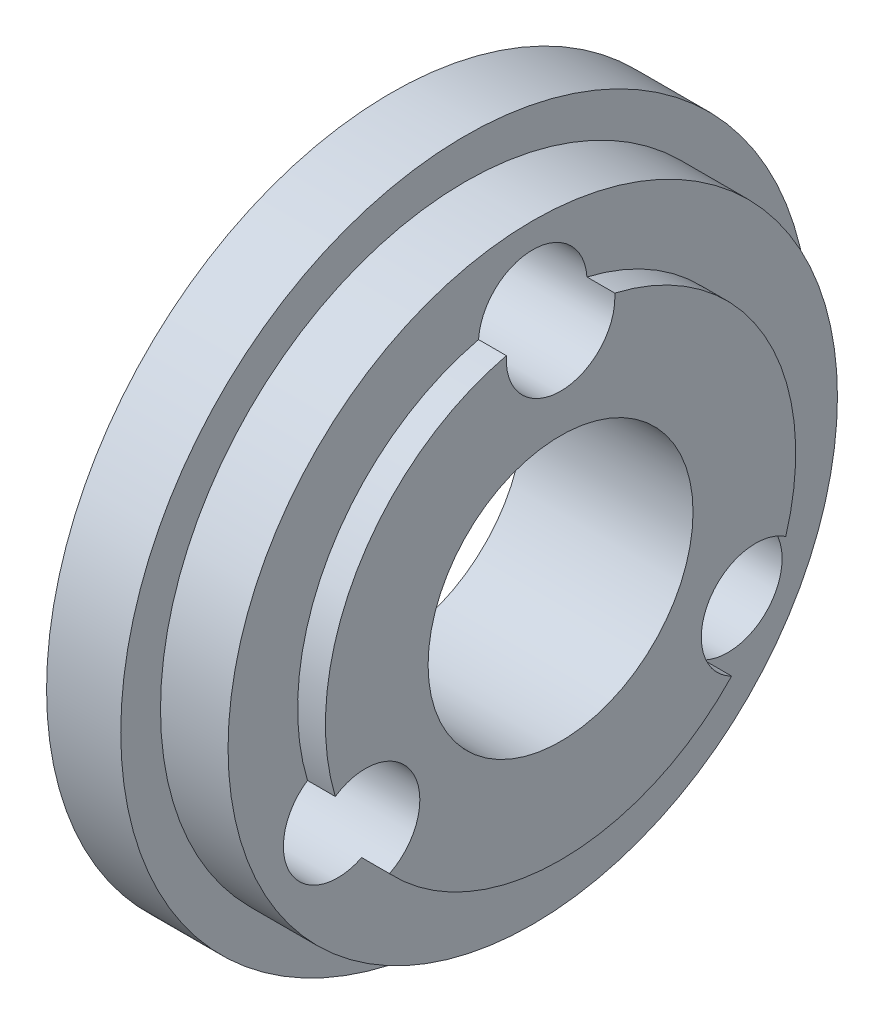
ISO-10303-21;
HEADER;
FILE_DESCRIPTION(('STEP AP214'),'2;1');
FILE_NAME('part.step','',(''),(''),'','','');
FILE_SCHEMA(('AUTOMOTIVE_DESIGN { 1 0 10303 214 1 1 1 1 }'));
ENDSEC;
DATA;
#1=APPLICATION_CONTEXT('core data for automotive mechanical design processes');
#2=APPLICATION_PROTOCOL_DEFINITION('international standard','automotive_design',2000,#1);
#3=PRODUCT_CONTEXT('',#1,'mechanical');
#4=PRODUCT('Part','Part','',(#3));
#5=PRODUCT_RELATED_PRODUCT_CATEGORY('part','',(#4));
#6=PRODUCT_DEFINITION_FORMATION('','',#4);
#7=PRODUCT_DEFINITION_CONTEXT('part definition',#1,'design');
#8=PRODUCT_DEFINITION('design','',#6,#7);
#9=PRODUCT_DEFINITION_SHAPE('','',#8);
#10=(LENGTH_UNIT() NAMED_UNIT(*) SI_UNIT(.MILLI.,.METRE.));
#11=(NAMED_UNIT(*) PLANE_ANGLE_UNIT() SI_UNIT($,.RADIAN.));
#12=(NAMED_UNIT(*) SI_UNIT($,.STERADIAN.) SOLID_ANGLE_UNIT());
#13=UNCERTAINTY_MEASURE_WITH_UNIT(LENGTH_MEASURE(1.E-05),#10,'distance_accuracy_value','');
#14=(GEOMETRIC_REPRESENTATION_CONTEXT(3) GLOBAL_UNCERTAINTY_ASSIGNED_CONTEXT((#13)) GLOBAL_UNIT_ASSIGNED_CONTEXT((#10,
#11,#12)) REPRESENTATION_CONTEXT('',''));
#15=CARTESIAN_POINT('',(0.,0.,0.));
#16=DIRECTION('',(0.,0.,1.));
#17=DIRECTION('',(1.,0.,0.));
#18=AXIS2_PLACEMENT_3D('',#15,#16,#17);
#19=CARTESIAN_POINT('',(5.35,11.5,0.));
#20=DIRECTION('',(-1.,0.,0.));
#21=DIRECTION('',(0.,0.,1.));
#22=AXIS2_PLACEMENT_3D('',#19,#20,#21);
#23=PLANE('',#22);
#24=CARTESIAN_POINT('',(5.35,-4.24999999999993,7.36121593216777));
#25=DIRECTION('',(1.,0.,0.));
#26=DIRECTION('',(0.,0.,-1.));
#27=AXIS2_PLACEMENT_3D('',#24,#25,#26);
#28=CIRCLE('',#27,2.05);
#29=CARTESIAN_POINT('',(5.35,-6.08947021574372,6.45631299516761));
#30=VERTEX_POINT('',#29);
#31=CARTESIAN_POINT('',(5.35,-2.54659596072673,8.50179240000662));
#32=VERTEX_POINT('',#31);
#33=EDGE_CURVE('E156',#30,#32,#28,.F.);
#34=ORIENTED_EDGE('',*,*,#33,.T.);
#35=CARTESIAN_POINT('',(5.35,0.,0.));
#36=DIRECTION('',(-1.,0.,0.));
#37=DIRECTION('',(0.,0.,1.));
#38=AXIS2_PLACEMENT_3D('',#35,#36,#37);
#39=CIRCLE('',#38,8.875);
#40=CARTESIAN_POINT('',(5.35,8.63606617647059,2.04547940483904));
#41=VERTEX_POINT('',#40);
#42=EDGE_CURVE('E79',#41,#32,#39,.F.);
#43=ORIENTED_EDGE('',*,*,#42,.F.);
#44=CARTESIAN_POINT('',(5.35,8.5,0.));
#45=DIRECTION('',(1.,0.,0.));
#46=DIRECTION('',(0.,0.,-1.));
#47=AXIS2_PLACEMENT_3D('',#44,#45,#46);
#48=CIRCLE('',#47,2.05);
#49=CARTESIAN_POINT('',(5.35,8.63606617647059,-2.04547940483904));
#50=VERTEX_POINT('',#49);
#51=EDGE_CURVE('E20',#41,#50,#48,.F.);
#52=ORIENTED_EDGE('',*,*,#51,.T.);
#53=CARTESIAN_POINT('',(5.35,0.,0.));
#54=DIRECTION('',(-1.,0.,0.));
#55=DIRECTION('',(0.,0.,1.));
#56=AXIS2_PLACEMENT_3D('',#53,#54,#55);
#57=CIRCLE('',#56,8.875);
#58=CARTESIAN_POINT('',(5.35,-2.54659596072685,-8.50179240000658));
#59=VERTEX_POINT('',#58);
#60=EDGE_CURVE('E68',#59,#50,#57,.F.);
#61=ORIENTED_EDGE('',*,*,#60,.F.);
#62=CARTESIAN_POINT('',(5.35,-4.25000000000003,-7.36121593216771));
#63=DIRECTION('',(1.,0.,0.));
#64=DIRECTION('',(0.,0.,-1.));
#65=AXIS2_PLACEMENT_3D('',#62,#63,#64);
#66=CIRCLE('',#65,2.05);
#67=CARTESIAN_POINT('',(5.35,-6.08947021574381,-6.45631299516753));
#68=VERTEX_POINT('',#67);
#69=EDGE_CURVE('E93',#59,#68,#66,.F.);
#70=ORIENTED_EDGE('',*,*,#69,.T.);
#71=CARTESIAN_POINT('',(5.35,0.,0.));
#72=DIRECTION('',(-1.,0.,0.));
#73=DIRECTION('',(0.,0.,1.));
#74=AXIS2_PLACEMENT_3D('',#71,#72,#73);
#75=CIRCLE('',#74,8.875);
#76=EDGE_CURVE('E158',#30,#68,#75,.F.);
#77=ORIENTED_EDGE('',*,*,#76,.F.);
#78=EDGE_LOOP('',(#34,#43,#52,#61,#70,#77));
#79=FACE_BOUND('',#78,.T.);
#80=CARTESIAN_POINT('',(5.35,0.,0.));
#81=DIRECTION('',(-1.,0.,0.));
#82=DIRECTION('',(0.,0.,1.));
#83=AXIS2_PLACEMENT_3D('',#80,#81,#82);
#84=CIRCLE('',#83,11.5);
#85=CARTESIAN_POINT('',(5.35,0.,11.5));
#86=VERTEX_POINT('',#85);
#87=EDGE_CURVE('E153',#86,#86,#84,.T.);
#88=ORIENTED_EDGE('',*,*,#87,.F.);
#89=EDGE_LOOP('',(#88));
#90=FACE_BOUND('',#89,.T.);
#91=ADVANCED_FACE('F17',(#79,#90),#23,.F.);
#92=CARTESIAN_POINT('',(0.,0.,0.));
#93=DIRECTION('',(-1.,0.,0.));
#94=DIRECTION('',(0.,0.,1.));
#95=AXIS2_PLACEMENT_3D('',#92,#93,#94);
#96=CYLINDRICAL_SURFACE('',#95,8.875);
#97=DIRECTION('',(-1.,0.,0.));
#98=VECTOR('',#97,1.);
#99=CARTESIAN_POINT('',(0.,8.63606617647059,2.04547940483904));
#100=LINE('',#99,#98);
#101=CARTESIAN_POINT('',(6.4,8.63606617647059,2.04547940483904));
#102=VERTEX_POINT('',#101);
#103=EDGE_CURVE('E97',#102,#41,#100,.T.);
#104=ORIENTED_EDGE('',*,*,#103,.T.);
#105=ORIENTED_EDGE('',*,*,#42,.T.);
#106=DIRECTION('',(-1.,0.,0.));
#107=VECTOR('',#106,1.);
#108=CARTESIAN_POINT('',(0.,-2.54659596072673,8.50179240000662));
#109=LINE('',#108,#107);
#110=CARTESIAN_POINT('',(6.4,-2.54659596072673,8.50179240000662));
#111=VERTEX_POINT('',#110);
#112=EDGE_CURVE('E87',#32,#111,#109,.F.);
#113=ORIENTED_EDGE('',*,*,#112,.T.);
#114=CARTESIAN_POINT('',(6.4,0.,0.));
#115=DIRECTION('',(-1.,0.,0.));
#116=DIRECTION('',(0.,0.,1.));
#117=AXIS2_PLACEMENT_3D('',#114,#115,#116);
#118=CIRCLE('',#117,8.875);
#119=EDGE_CURVE('E141',#111,#102,#118,.T.);
#120=ORIENTED_EDGE('',*,*,#119,.T.);
#121=EDGE_LOOP('',(#104,#105,#113,#120));
#122=FACE_BOUND('',#121,.T.);
#123=ADVANCED_FACE('F162',(#122),#96,.T.);
#124=CARTESIAN_POINT('',(6.4,8.5,0.));
#125=DIRECTION('',(1.,0.,0.));
#126=DIRECTION('',(0.,0.,-1.));
#127=AXIS2_PLACEMENT_3D('',#124,#125,#126);
#128=CYLINDRICAL_SURFACE('',#127,2.05);
#129=CARTESIAN_POINT('',(6.4,8.5,0.));
#130=DIRECTION('',(1.,0.,0.));
#131=DIRECTION('',(0.,0.,-1.));
#132=AXIS2_PLACEMENT_3D('',#129,#130,#131);
#133=CIRCLE('',#132,2.05);
#134=CARTESIAN_POINT('',(6.4,8.63606617647059,-2.04547940483904));
#135=VERTEX_POINT('',#134);
#136=EDGE_CURVE('E91',#102,#135,#133,.T.);
#137=ORIENTED_EDGE('',*,*,#136,.T.);
#138=DIRECTION('',(-1.,0.,0.));
#139=VECTOR('',#138,1.);
#140=CARTESIAN_POINT('',(0.,8.63606617647059,-2.04547940483904));
#141=LINE('',#140,#139);
#142=EDGE_CURVE('E73',#50,#135,#141,.F.);
#143=ORIENTED_EDGE('',*,*,#142,.F.);
#144=ORIENTED_EDGE('',*,*,#51,.F.);
#145=ORIENTED_EDGE('',*,*,#103,.F.);
#146=EDGE_LOOP('',(#137,#143,#144,#145));
#147=FACE_BOUND('',#146,.T.);
#148=CARTESIAN_POINT('',(1.7,8.5,0.));
#149=DIRECTION('',(1.,0.,0.));
#150=DIRECTION('',(0.,0.,-1.));
#151=AXIS2_PLACEMENT_3D('',#148,#149,#150);
#152=CIRCLE('',#151,2.05);
#153=CARTESIAN_POINT('',(1.7,8.5,-2.05));
#154=VERTEX_POINT('',#153);
#155=EDGE_CURVE('E144',#154,#154,#152,.F.);
#156=ORIENTED_EDGE('',*,*,#155,.T.);
#157=EDGE_LOOP('',(#156));
#158=FACE_BOUND('',#157,.T.);
#159=ADVANCED_FACE('F88',(#147,#158),#128,.F.);
#160=CARTESIAN_POINT('',(0.,0.,0.));
#161=DIRECTION('',(-1.,0.,0.));
#162=DIRECTION('',(0.,0.,1.));
#163=AXIS2_PLACEMENT_3D('',#160,#161,#162);
#164=CYLINDRICAL_SURFACE('',#163,8.875);
#165=ORIENTED_EDGE('',*,*,#60,.T.);
#166=ORIENTED_EDGE('',*,*,#142,.T.);
#167=CARTESIAN_POINT('',(6.4,0.,0.));
#168=DIRECTION('',(-1.,0.,0.));
#169=DIRECTION('',(0.,0.,1.));
#170=AXIS2_PLACEMENT_3D('',#167,#168,#169);
#171=CIRCLE('',#170,8.875);
#172=CARTESIAN_POINT('',(6.4,-2.54659596072685,-8.50179240000658));
#173=VERTEX_POINT('',#172);
#174=EDGE_CURVE('E138',#135,#173,#171,.T.);
#175=ORIENTED_EDGE('',*,*,#174,.T.);
#176=DIRECTION('',(1.,0.,0.));
#177=VECTOR('',#176,1.);
#178=CARTESIAN_POINT('',(6.4,-2.54659596072685,-8.50179240000658));
#179=LINE('',#178,#177);
#180=EDGE_CURVE('E76',#173,#59,#179,.F.);
#181=ORIENTED_EDGE('',*,*,#180,.T.);
#182=EDGE_LOOP('',(#165,#166,#175,#181));
#183=FACE_BOUND('',#182,.T.);
#184=ADVANCED_FACE('F70',(#183),#164,.T.);
#185=CARTESIAN_POINT('',(6.4,-4.25000000000003,-7.36121593216771));
#186=DIRECTION('',(1.,0.,0.));
#187=DIRECTION('',(0.,0.,-1.));
#188=AXIS2_PLACEMENT_3D('',#185,#186,#187);
#189=CYLINDRICAL_SURFACE('',#188,2.05);
#190=ORIENTED_EDGE('',*,*,#69,.F.);
#191=ORIENTED_EDGE('',*,*,#180,.F.);
#192=CARTESIAN_POINT('',(6.4,-4.25000000000003,-7.36121593216771));
#193=DIRECTION('',(1.,0.,0.));
#194=DIRECTION('',(0.,0.,-1.));
#195=AXIS2_PLACEMENT_3D('',#192,#193,#194);
#196=CIRCLE('',#195,2.05);
#197=CARTESIAN_POINT('',(6.4,-6.08947021574381,-6.45631299516753));
#198=VERTEX_POINT('',#197);
#199=EDGE_CURVE('E135',#173,#198,#196,.T.);
#200=ORIENTED_EDGE('',*,*,#199,.T.);
#201=DIRECTION('',(-1.,0.,0.));
#202=VECTOR('',#201,1.);
#203=CARTESIAN_POINT('',(0.,-6.08947021574381,-6.45631299516753));
#204=LINE('',#203,#202);
#205=EDGE_CURVE('E160',#68,#198,#204,.F.);
#206=ORIENTED_EDGE('',*,*,#205,.F.);
#207=EDGE_LOOP('',(#190,#191,#200,#206));
#208=FACE_BOUND('',#207,.T.);
#209=CARTESIAN_POINT('',(1.7,-4.25000000000003,-7.36121593216771));
#210=DIRECTION('',(1.,0.,0.));
#211=DIRECTION('',(0.,0.,-1.));
#212=AXIS2_PLACEMENT_3D('',#209,#210,#211);
#213=CIRCLE('',#212,2.05);
#214=CARTESIAN_POINT('',(1.7,-4.25000000000003,-9.41121593216771));
#215=VERTEX_POINT('',#214);
#216=EDGE_CURVE('E147',#215,#215,#213,.F.);
#217=ORIENTED_EDGE('',*,*,#216,.T.);
#218=EDGE_LOOP('',(#217));
#219=FACE_BOUND('',#218,.T.);
#220=ADVANCED_FACE('F173',(#208,#219),#189,.F.);
#221=CARTESIAN_POINT('',(0.,0.,0.));
#222=DIRECTION('',(-1.,0.,0.));
#223=DIRECTION('',(0.,0.,1.));
#224=AXIS2_PLACEMENT_3D('',#221,#222,#223);
#225=CYLINDRICAL_SURFACE('',#224,8.875);
#226=ORIENTED_EDGE('',*,*,#76,.T.);
#227=ORIENTED_EDGE('',*,*,#205,.T.);
#228=CARTESIAN_POINT('',(6.4,0.,0.));
#229=DIRECTION('',(-1.,0.,0.));
#230=DIRECTION('',(0.,0.,1.));
#231=AXIS2_PLACEMENT_3D('',#228,#229,#230);
#232=CIRCLE('',#231,8.875);
#233=CARTESIAN_POINT('',(6.4,-6.08947021574372,6.45631299516761));
#234=VERTEX_POINT('',#233);
#235=EDGE_CURVE('E132',#198,#234,#232,.T.);
#236=ORIENTED_EDGE('',*,*,#235,.T.);
#237=DIRECTION('',(1.,0.,0.));
#238=VECTOR('',#237,1.);
#239=CARTESIAN_POINT('',(6.4,-6.08947021574372,6.45631299516761));
#240=LINE('',#239,#238);
#241=EDGE_CURVE('E35',#234,#30,#240,.F.);
#242=ORIENTED_EDGE('',*,*,#241,.T.);
#243=EDGE_LOOP('',(#226,#227,#236,#242));
#244=FACE_BOUND('',#243,.T.);
#245=ADVANCED_FACE('F177',(#244),#225,.T.);
#246=CARTESIAN_POINT('',(6.4,-4.24999999999993,7.36121593216777));
#247=DIRECTION('',(1.,0.,0.));
#248=DIRECTION('',(0.,0.,-1.));
#249=AXIS2_PLACEMENT_3D('',#246,#247,#248);
#250=CYLINDRICAL_SURFACE('',#249,2.05);
#251=CARTESIAN_POINT('',(6.4,-4.24999999999993,7.36121593216777));
#252=DIRECTION('',(1.,0.,0.));
#253=DIRECTION('',(0.,0.,-1.));
#254=AXIS2_PLACEMENT_3D('',#251,#252,#253);
#255=CIRCLE('',#254,2.05);
#256=EDGE_CURVE('E130',#234,#111,#255,.T.);
#257=ORIENTED_EDGE('',*,*,#256,.T.);
#258=ORIENTED_EDGE('',*,*,#112,.F.);
#259=ORIENTED_EDGE('',*,*,#33,.F.);
#260=ORIENTED_EDGE('',*,*,#241,.F.);
#261=EDGE_LOOP('',(#257,#258,#259,#260));
#262=FACE_BOUND('',#261,.T.);
#263=CARTESIAN_POINT('',(1.7,-4.24999999999993,7.36121593216777));
#264=DIRECTION('',(1.,0.,0.));
#265=DIRECTION('',(0.,0.,-1.));
#266=AXIS2_PLACEMENT_3D('',#263,#264,#265);
#267=CIRCLE('',#266,2.05);
#268=CARTESIAN_POINT('',(1.7,-4.24999999999993,5.31121593216777));
#269=VERTEX_POINT('',#268);
#270=EDGE_CURVE('E150',#269,#269,#267,.F.);
#271=ORIENTED_EDGE('',*,*,#270,.T.);
#272=EDGE_LOOP('',(#271));
#273=FACE_BOUND('',#272,.T.);
#274=ADVANCED_FACE('F164',(#262,#273),#250,.F.);
#275=CARTESIAN_POINT('',(0.,0.,0.));
#276=DIRECTION('',(-1.,0.,0.));
#277=DIRECTION('',(0.,0.,1.));
#278=AXIS2_PLACEMENT_3D('',#275,#276,#277);
#279=CYLINDRICAL_SURFACE('',#278,11.5);
#280=CARTESIAN_POINT('',(2.8,0.,0.));
#281=DIRECTION('',(-1.,0.,0.));
#282=DIRECTION('',(0.,0.,1.));
#283=AXIS2_PLACEMENT_3D('',#280,#281,#282);
#284=CIRCLE('',#283,11.5);
#285=CARTESIAN_POINT('',(2.8,0.,11.5));
#286=VERTEX_POINT('',#285);
#287=EDGE_CURVE('E127',#286,#286,#284,.F.);
#288=ORIENTED_EDGE('',*,*,#287,.T.);
#289=EDGE_LOOP('',(#288));
#290=FACE_BOUND('',#289,.T.);
#291=ORIENTED_EDGE('',*,*,#87,.T.);
#292=EDGE_LOOP('',(#291));
#293=FACE_BOUND('',#292,.T.);
#294=ADVANCED_FACE('F185',(#290,#293),#279,.T.);
#295=CARTESIAN_POINT('',(1.7,-3.19999999999993,7.36121593216777));
#296=DIRECTION('',(-1.,0.,0.));
#297=DIRECTION('',(0.,0.,1.));
#298=AXIS2_PLACEMENT_3D('',#295,#296,#297);
#299=PLANE('',#298);
#300=ORIENTED_EDGE('',*,*,#270,.F.);
#301=EDGE_LOOP('',(#300));
#302=FACE_BOUND('',#301,.T.);
#303=CARTESIAN_POINT('',(1.7,-4.24999999999993,7.36121593216777));
#304=DIRECTION('',(1.,0.,0.));
#305=DIRECTION('',(0.,0.,-1.));
#306=AXIS2_PLACEMENT_3D('',#303,#304,#305);
#307=CIRCLE('',#306,1.05);
#308=CARTESIAN_POINT('',(1.7,-4.24999999999993,6.31121593216777));
#309=VERTEX_POINT('',#308);
#310=EDGE_CURVE('E124',#309,#309,#307,.F.);
#311=ORIENTED_EDGE('',*,*,#310,.T.);
#312=EDGE_LOOP('',(#311));
#313=FACE_BOUND('',#312,.T.);
#314=ADVANCED_FACE('F230',(#302,#313),#299,.F.);
#315=CARTESIAN_POINT('',(1.7,-3.20000000000004,-7.36121593216771));
#316=DIRECTION('',(-1.,0.,0.));
#317=DIRECTION('',(0.,0.,1.));
#318=AXIS2_PLACEMENT_3D('',#315,#316,#317);
#319=PLANE('',#318);
#320=ORIENTED_EDGE('',*,*,#216,.F.);
#321=EDGE_LOOP('',(#320));
#322=FACE_BOUND('',#321,.T.);
#323=CARTESIAN_POINT('',(1.7,-4.25000000000003,-7.36121593216771));
#324=DIRECTION('',(1.,0.,0.));
#325=DIRECTION('',(0.,0.,-1.));
#326=AXIS2_PLACEMENT_3D('',#323,#324,#325);
#327=CIRCLE('',#326,1.05);
#328=CARTESIAN_POINT('',(1.7,-4.25000000000003,-8.41121593216771));
#329=VERTEX_POINT('',#328);
#330=EDGE_CURVE('E121',#329,#329,#327,.F.);
#331=ORIENTED_EDGE('',*,*,#330,.T.);
#332=EDGE_LOOP('',(#331));
#333=FACE_BOUND('',#332,.T.);
#334=ADVANCED_FACE('F226',(#322,#333),#319,.F.);
#335=CARTESIAN_POINT('',(1.7,9.55,0.));
#336=DIRECTION('',(-1.,0.,0.));
#337=DIRECTION('',(0.,0.,1.));
#338=AXIS2_PLACEMENT_3D('',#335,#336,#337);
#339=PLANE('',#338);
#340=ORIENTED_EDGE('',*,*,#155,.F.);
#341=EDGE_LOOP('',(#340));
#342=FACE_BOUND('',#341,.T.);
#343=CARTESIAN_POINT('',(1.7,8.5,0.));
#344=DIRECTION('',(1.,0.,0.));
#345=DIRECTION('',(0.,0.,-1.));
#346=AXIS2_PLACEMENT_3D('',#343,#344,#345);
#347=CIRCLE('',#346,1.05);
#348=CARTESIAN_POINT('',(1.7,8.5,-1.05));
#349=VERTEX_POINT('',#348);
#350=EDGE_CURVE('E118',#349,#349,#347,.F.);
#351=ORIENTED_EDGE('',*,*,#350,.T.);
#352=EDGE_LOOP('',(#351));
#353=FACE_BOUND('',#352,.T.);
#354=ADVANCED_FACE('F223',(#342,#353),#339,.F.);
#355=CARTESIAN_POINT('',(6.4,8.875,0.));
#356=DIRECTION('',(-1.,0.,0.));
#357=DIRECTION('',(0.,0.,1.));
#358=AXIS2_PLACEMENT_3D('',#355,#356,#357);
#359=PLANE('',#358);
#360=ORIENTED_EDGE('',*,*,#235,.F.);
#361=ORIENTED_EDGE('',*,*,#199,.F.);
#362=ORIENTED_EDGE('',*,*,#174,.F.);
#363=ORIENTED_EDGE('',*,*,#136,.F.);
#364=ORIENTED_EDGE('',*,*,#119,.F.);
#365=ORIENTED_EDGE('',*,*,#256,.F.);
#366=EDGE_LOOP('',(#360,#361,#362,#363,#364,#365));
#367=FACE_BOUND('',#366,.T.);
#368=CARTESIAN_POINT('',(6.4,0.,0.));
#369=DIRECTION('',(-1.,0.,0.));
#370=DIRECTION('',(0.,0.,1.));
#371=AXIS2_PLACEMENT_3D('',#368,#369,#370);
#372=CIRCLE('',#371,5.);
#373=CARTESIAN_POINT('',(6.4,0.,5.));
#374=VERTEX_POINT('',#373);
#375=EDGE_CURVE('E115',#374,#374,#372,.T.);
#376=ORIENTED_EDGE('',*,*,#375,.T.);
#377=EDGE_LOOP('',(#376));
#378=FACE_BOUND('',#377,.T.);
#379=ADVANCED_FACE('F169',(#367,#378),#359,.F.);
#380=CARTESIAN_POINT('',(2.8,13.,0.));
#381=DIRECTION('',(-1.,0.,0.));
#382=DIRECTION('',(0.,0.,1.));
#383=AXIS2_PLACEMENT_3D('',#380,#381,#382);
#384=PLANE('',#383);
#385=ORIENTED_EDGE('',*,*,#287,.F.);
#386=EDGE_LOOP('',(#385));
#387=FACE_BOUND('',#386,.T.);
#388=CARTESIAN_POINT('',(2.8,0.,0.));
#389=DIRECTION('',(-1.,0.,0.));
#390=DIRECTION('',(0.,0.,1.));
#391=AXIS2_PLACEMENT_3D('',#388,#389,#390);
#392=CIRCLE('',#391,13.);
#393=CARTESIAN_POINT('',(2.8,0.,13.));
#394=VERTEX_POINT('',#393);
#395=EDGE_CURVE('E112',#394,#394,#392,.T.);
#396=ORIENTED_EDGE('',*,*,#395,.F.);
#397=EDGE_LOOP('',(#396));
#398=FACE_BOUND('',#397,.T.);
#399=ADVANCED_FACE('F216',(#387,#398),#384,.F.);
#400=CARTESIAN_POINT('',(6.4,-4.24999999999993,7.36121593216777));
#401=DIRECTION('',(1.,0.,0.));
#402=DIRECTION('',(0.,0.,-1.));
#403=AXIS2_PLACEMENT_3D('',#400,#401,#402);
#404=CYLINDRICAL_SURFACE('',#403,1.05);
#405=CARTESIAN_POINT('',(0.,-4.24999999999993,7.36121593216777));
#406=DIRECTION('',(1.,0.,0.));
#407=DIRECTION('',(0.,0.,-1.));
#408=AXIS2_PLACEMENT_3D('',#405,#406,#407);
#409=CIRCLE('',#408,1.05);
#410=CARTESIAN_POINT('',(0.,-4.24999999999993,6.31121593216777));
#411=VERTEX_POINT('',#410);
#412=EDGE_CURVE('E109',#411,#411,#409,.F.);
#413=ORIENTED_EDGE('',*,*,#412,.T.);
#414=EDGE_LOOP('',(#413));
#415=FACE_BOUND('',#414,.T.);
#416=ORIENTED_EDGE('',*,*,#310,.F.);
#417=EDGE_LOOP('',(#416));
#418=FACE_BOUND('',#417,.T.);
#419=ADVANCED_FACE('F212',(#415,#418),#404,.F.);
#420=CARTESIAN_POINT('',(6.4,-4.25000000000003,-7.36121593216771));
#421=DIRECTION('',(1.,0.,0.));
#422=DIRECTION('',(0.,0.,-1.));
#423=AXIS2_PLACEMENT_3D('',#420,#421,#422);
#424=CYLINDRICAL_SURFACE('',#423,1.05);
#425=CARTESIAN_POINT('',(0.,-4.25000000000003,-7.36121593216771));
#426=DIRECTION('',(1.,0.,0.));
#427=DIRECTION('',(0.,0.,-1.));
#428=AXIS2_PLACEMENT_3D('',#425,#426,#427);
#429=CIRCLE('',#428,1.05);
#430=CARTESIAN_POINT('',(0.,-4.25000000000003,-8.41121593216771));
#431=VERTEX_POINT('',#430);
#432=EDGE_CURVE('E106',#431,#431,#429,.F.);
#433=ORIENTED_EDGE('',*,*,#432,.T.);
#434=EDGE_LOOP('',(#433));
#435=FACE_BOUND('',#434,.T.);
#436=ORIENTED_EDGE('',*,*,#330,.F.);
#437=EDGE_LOOP('',(#436));
#438=FACE_BOUND('',#437,.T.);
#439=ADVANCED_FACE('F208',(#435,#438),#424,.F.);
#440=CARTESIAN_POINT('',(6.4,8.5,0.));
#441=DIRECTION('',(1.,0.,0.));
#442=DIRECTION('',(0.,0.,-1.));
#443=AXIS2_PLACEMENT_3D('',#440,#441,#442);
#444=CYLINDRICAL_SURFACE('',#443,1.05);
#445=CARTESIAN_POINT('',(0.,8.5,0.));
#446=DIRECTION('',(1.,0.,0.));
#447=DIRECTION('',(0.,0.,-1.));
#448=AXIS2_PLACEMENT_3D('',#445,#446,#447);
#449=CIRCLE('',#448,1.05);
#450=CARTESIAN_POINT('',(0.,8.5,-1.05));
#451=VERTEX_POINT('',#450);
#452=EDGE_CURVE('E103',#451,#451,#449,.F.);
#453=ORIENTED_EDGE('',*,*,#452,.T.);
#454=EDGE_LOOP('',(#453));
#455=FACE_BOUND('',#454,.T.);
#456=ORIENTED_EDGE('',*,*,#350,.F.);
#457=EDGE_LOOP('',(#456));
#458=FACE_BOUND('',#457,.T.);
#459=ADVANCED_FACE('F204',(#455,#458),#444,.F.);
#460=CARTESIAN_POINT('',(0.,0.,0.));
#461=DIRECTION('',(-1.,0.,0.));
#462=DIRECTION('',(0.,0.,1.));
#463=AXIS2_PLACEMENT_3D('',#460,#461,#462);
#464=CYLINDRICAL_SURFACE('',#463,5.);
#465=ORIENTED_EDGE('',*,*,#375,.F.);
#466=EDGE_LOOP('',(#465));
#467=FACE_BOUND('',#466,.T.);
#468=CARTESIAN_POINT('',(0.,0.,0.));
#469=DIRECTION('',(-1.,0.,0.));
#470=DIRECTION('',(0.,0.,1.));
#471=AXIS2_PLACEMENT_3D('',#468,#469,#470);
#472=CIRCLE('',#471,5.);
#473=CARTESIAN_POINT('',(0.,0.,5.));
#474=VERTEX_POINT('',#473);
#475=EDGE_CURVE('E26',#474,#474,#472,.T.);
#476=ORIENTED_EDGE('',*,*,#475,.T.);
#477=EDGE_LOOP('',(#476));
#478=FACE_BOUND('',#477,.T.);
#479=ADVANCED_FACE('F196',(#467,#478),#464,.F.);
#480=CARTESIAN_POINT('',(0.,0.,0.));
#481=DIRECTION('',(-1.,0.,0.));
#482=DIRECTION('',(0.,0.,1.));
#483=AXIS2_PLACEMENT_3D('',#480,#481,#482);
#484=CYLINDRICAL_SURFACE('',#483,13.);
#485=CARTESIAN_POINT('',(0.,0.,0.));
#486=DIRECTION('',(-1.,0.,0.));
#487=DIRECTION('',(0.,0.,1.));
#488=AXIS2_PLACEMENT_3D('',#485,#486,#487);
#489=CIRCLE('',#488,13.);
#490=CARTESIAN_POINT('',(0.,0.,13.));
#491=VERTEX_POINT('',#490);
#492=EDGE_CURVE('E11',#491,#491,#489,.F.);
#493=ORIENTED_EDGE('',*,*,#492,.T.);
#494=EDGE_LOOP('',(#493));
#495=FACE_BOUND('',#494,.T.);
#496=ORIENTED_EDGE('',*,*,#395,.T.);
#497=EDGE_LOOP('',(#496));
#498=FACE_BOUND('',#497,.T.);
#499=ADVANCED_FACE('F190',(#495,#498),#484,.T.);
#500=CARTESIAN_POINT('',(0.,5.,0.));
#501=DIRECTION('',(1.,0.,0.));
#502=DIRECTION('',(0.,0.,-1.));
#503=AXIS2_PLACEMENT_3D('',#500,#501,#502);
#504=PLANE('',#503);
#505=ORIENTED_EDGE('',*,*,#492,.F.);
#506=EDGE_LOOP('',(#505));
#507=FACE_BOUND('',#506,.T.);
#508=ORIENTED_EDGE('',*,*,#475,.F.);
#509=EDGE_LOOP('',(#508));
#510=FACE_BOUND('',#509,.T.);
#511=ORIENTED_EDGE('',*,*,#452,.F.);
#512=EDGE_LOOP('',(#511));
#513=FACE_BOUND('',#512,.T.);
#514=ORIENTED_EDGE('',*,*,#432,.F.);
#515=EDGE_LOOP('',(#514));
#516=FACE_BOUND('',#515,.T.);
#517=ORIENTED_EDGE('',*,*,#412,.F.);
#518=EDGE_LOOP('',(#517));
#519=FACE_BOUND('',#518,.T.);
#520=ADVANCED_FACE('F188',(#507,#510,#513,#516,#519),#504,.F.);
#521=CLOSED_SHELL('',(#91,#123,#159,#184,#220,#245,#274,#294,#314,#334,#354,#379,#399,#419,#439,
#459,#479,#499,#520));
#522=MANIFOLD_SOLID_BREP('B1',#521);
#523=ADVANCED_BREP_SHAPE_REPRESENTATION('',(#18,#522),#14);
#524=SHAPE_DEFINITION_REPRESENTATION(#9,#523);
ENDSEC;
END-ISO-10303-21;
